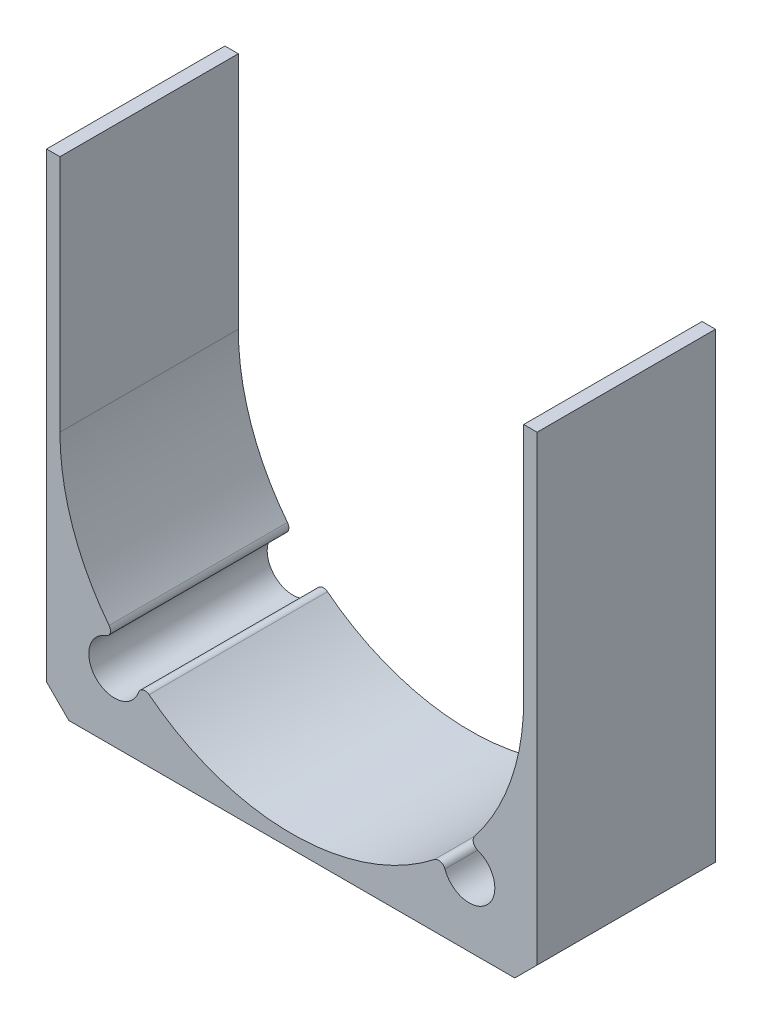
ISO-10303-21;
HEADER;
FILE_DESCRIPTION(('STEP AP214'),'2;1');
FILE_NAME('part.step','',(''),(''),'','','');
FILE_SCHEMA(('AUTOMOTIVE_DESIGN { 1 0 10303 214 1 1 1 1 }'));
ENDSEC;
DATA;
#1=APPLICATION_CONTEXT('core data for automotive mechanical design processes');
#2=APPLICATION_PROTOCOL_DEFINITION('international standard','automotive_design',2000,#1);
#3=PRODUCT_CONTEXT('',#1,'mechanical');
#4=PRODUCT('Part','Part','',(#3));
#5=PRODUCT_RELATED_PRODUCT_CATEGORY('part','',(#4));
#6=PRODUCT_DEFINITION_FORMATION('','',#4);
#7=PRODUCT_DEFINITION_CONTEXT('part definition',#1,'design');
#8=PRODUCT_DEFINITION('design','',#6,#7);
#9=PRODUCT_DEFINITION_SHAPE('','',#8);
#10=(LENGTH_UNIT() NAMED_UNIT(*) SI_UNIT(.MILLI.,.METRE.));
#11=(NAMED_UNIT(*) PLANE_ANGLE_UNIT() SI_UNIT($,.RADIAN.));
#12=(NAMED_UNIT(*) SI_UNIT($,.STERADIAN.) SOLID_ANGLE_UNIT());
#13=UNCERTAINTY_MEASURE_WITH_UNIT(LENGTH_MEASURE(1.E-05),#10,'distance_accuracy_value','');
#14=(GEOMETRIC_REPRESENTATION_CONTEXT(3) GLOBAL_UNCERTAINTY_ASSIGNED_CONTEXT((#13)) GLOBAL_UNIT_ASSIGNED_CONTEXT((#10,
#11,#12)) REPRESENTATION_CONTEXT('',''));
#15=CARTESIAN_POINT('',(0.,0.,0.));
#16=DIRECTION('',(0.,0.,1.));
#17=DIRECTION('',(1.,0.,0.));
#18=AXIS2_PLACEMENT_3D('',#15,#16,#17);
#19=CARTESIAN_POINT('',(0.,0.,80.));
#20=DIRECTION('',(0.,0.,-1.));
#21=DIRECTION('',(-1.,0.,0.));
#22=AXIS2_PLACEMENT_3D('',#19,#20,#21);
#23=CYLINDRICAL_SURFACE('',#22,104.);
#24=CARTESIAN_POINT('',(0.,0.,80.));
#25=DIRECTION('',(0.,0.,-1.));
#26=DIRECTION('',(1.,0.,0.));
#27=AXIS2_PLACEMENT_3D('',#24,#25,#26);
#28=CIRCLE('',#27,104.);
#29=CARTESIAN_POINT('',(-81.965079959966,-64.013480354972,80.));
#30=VERTEX_POINT('',#29);
#31=CARTESIAN_POINT('',(-104.,0.,80.));
#32=VERTEX_POINT('',#31);
#33=EDGE_CURVE('E333',#30,#32,#28,.T.);
#34=ORIENTED_EDGE('',*,*,#33,.F.);
#35=DIRECTION('',(0.,0.,-1.));
#36=VECTOR('',#35,1.);
#37=CARTESIAN_POINT('',(-81.965079959966,-64.013480354972,80.));
#38=LINE('',#37,#36);
#39=CARTESIAN_POINT('',(-81.965079959966,-64.013480354972,0.));
#40=VERTEX_POINT('',#39);
#41=EDGE_CURVE('E283',#30,#40,#38,.T.);
#42=ORIENTED_EDGE('',*,*,#41,.T.);
#43=CARTESIAN_POINT('',(0.,0.,0.));
#44=DIRECTION('',(0.,0.,-1.));
#45=DIRECTION('',(1.,0.,0.));
#46=AXIS2_PLACEMENT_3D('',#43,#44,#45);
#47=CIRCLE('',#46,104.);
#48=CARTESIAN_POINT('',(-104.,0.,0.));
#49=VERTEX_POINT('',#48);
#50=EDGE_CURVE('E210',#40,#49,#47,.T.);
#51=ORIENTED_EDGE('',*,*,#50,.T.);
#52=DIRECTION('',(0.,0.,-1.));
#53=VECTOR('',#52,1.);
#54=CARTESIAN_POINT('',(-104.,0.,80.));
#55=LINE('',#54,#53);
#56=EDGE_CURVE('E219',#32,#49,#55,.T.);
#57=ORIENTED_EDGE('',*,*,#56,.F.);
#58=EDGE_LOOP('',(#34,#42,#51,#57));
#59=FACE_BOUND('',#58,.T.);
#60=ADVANCED_FACE('F40',(#59),#23,.F.);
#61=CARTESIAN_POINT('',(64.013480354972,-81.965079959966,80.));
#62=VERTEX_POINT('',#61);
#63=CARTESIAN_POINT('',(-64.013480354972,-81.965079959966,80.));
#64=VERTEX_POINT('',#63);
#65=EDGE_CURVE('E337',#62,#64,#28,.T.);
#66=ORIENTED_EDGE('',*,*,#65,.F.);
#67=DIRECTION('',(0.,0.,-1.));
#68=VECTOR('',#67,1.);
#69=CARTESIAN_POINT('',(64.013480354972,-81.965079959966,80.));
#70=LINE('',#69,#68);
#71=CARTESIAN_POINT('',(64.013480354972,-81.965079959966,0.));
#72=VERTEX_POINT('',#71);
#73=EDGE_CURVE('E239',#62,#72,#70,.T.);
#74=ORIENTED_EDGE('',*,*,#73,.T.);
#75=CARTESIAN_POINT('',(-64.013480354972,-81.965079959966,0.));
#76=VERTEX_POINT('',#75);
#77=EDGE_CURVE('E216',#72,#76,#47,.T.);
#78=ORIENTED_EDGE('',*,*,#77,.T.);
#79=DIRECTION('',(0.,0.,-1.));
#80=VECTOR('',#79,1.);
#81=CARTESIAN_POINT('',(-64.013480354972,-81.965079959966,80.));
#82=LINE('',#81,#80);
#83=EDGE_CURVE('E235',#76,#64,#82,.F.);
#84=ORIENTED_EDGE('',*,*,#83,.T.);
#85=EDGE_LOOP('',(#66,#74,#78,#84));
#86=FACE_BOUND('',#85,.T.);
#87=ADVANCED_FACE('F404',(#86),#23,.F.);
#88=CARTESIAN_POINT('',(-110.,110.,80.));
#89=DIRECTION('',(1.,0.,0.));
#90=DIRECTION('',(0.,1.,0.));
#91=AXIS2_PLACEMENT_3D('',#88,#89,#90);
#92=PLANE('',#91);
#93=DIRECTION('',(0.,-1.,0.));
#94=VECTOR('',#93,1.);
#95=CARTESIAN_POINT('',(-110.,110.,80.));
#96=LINE('',#95,#94);
#97=CARTESIAN_POINT('',(-110.,107.,80.));
#98=VERTEX_POINT('',#97);
#99=CARTESIAN_POINT('',(-110.,-100.,80.));
#100=VERTEX_POINT('',#99);
#101=EDGE_CURVE('E181',#98,#100,#96,.T.);
#102=ORIENTED_EDGE('',*,*,#101,.F.);
#103=DIRECTION('',(0.,0.,1.));
#104=VECTOR('',#103,1.);
#105=CARTESIAN_POINT('',(-110.,107.,0.));
#106=LINE('',#105,#104);
#107=CARTESIAN_POINT('',(-110.,107.,0.));
#108=VERTEX_POINT('',#107);
#109=EDGE_CURVE('E166',#108,#98,#106,.T.);
#110=ORIENTED_EDGE('',*,*,#109,.F.);
#111=DIRECTION('',(0.,-1.,0.));
#112=VECTOR('',#111,1.);
#113=CARTESIAN_POINT('',(-110.,110.,0.));
#114=LINE('',#113,#112);
#115=CARTESIAN_POINT('',(-110.,-100.,0.));
#116=VERTEX_POINT('',#115);
#117=EDGE_CURVE('E179',#108,#116,#114,.T.);
#118=ORIENTED_EDGE('',*,*,#117,.T.);
#119=DIRECTION('',(0.,0.,1.));
#120=VECTOR('',#119,1.);
#121=CARTESIAN_POINT('',(-110.,-100.,80.));
#122=LINE('',#121,#120);
#123=EDGE_CURVE('E50',#116,#100,#122,.T.);
#124=ORIENTED_EDGE('',*,*,#123,.T.);
#125=EDGE_LOOP('',(#102,#110,#118,#124));
#126=FACE_BOUND('',#125,.T.);
#127=ADVANCED_FACE('F177',(#126),#92,.F.);
#128=CARTESIAN_POINT('',(110.,-110.,80.));
#129=DIRECTION('',(0.,1.,0.));
#130=DIRECTION('',(-1.,0.,0.));
#131=AXIS2_PLACEMENT_3D('',#128,#129,#130);
#132=PLANE('',#131);
#133=DIRECTION('',(1.,0.,0.));
#134=VECTOR('',#133,1.);
#135=CARTESIAN_POINT('',(110.,-110.,0.));
#136=LINE('',#135,#134);
#137=CARTESIAN_POINT('',(-100.,-110.,0.));
#138=VERTEX_POINT('',#137);
#139=CARTESIAN_POINT('',(100.,-110.,0.));
#140=VERTEX_POINT('',#139);
#141=EDGE_CURVE('E189',#138,#140,#136,.T.);
#142=ORIENTED_EDGE('',*,*,#141,.T.);
#143=DIRECTION('',(0.,0.,1.));
#144=VECTOR('',#143,1.);
#145=CARTESIAN_POINT('',(100.,-110.,80.));
#146=LINE('',#145,#144);
#147=CARTESIAN_POINT('',(100.,-110.,80.));
#148=VERTEX_POINT('',#147);
#149=EDGE_CURVE('E300',#140,#148,#146,.T.);
#150=ORIENTED_EDGE('',*,*,#149,.T.);
#151=DIRECTION('',(1.,0.,0.));
#152=VECTOR('',#151,1.);
#153=CARTESIAN_POINT('',(110.,-110.,80.));
#154=LINE('',#153,#152);
#155=CARTESIAN_POINT('',(-100.,-110.,80.));
#156=VERTEX_POINT('',#155);
#157=EDGE_CURVE('E316',#156,#148,#154,.T.);
#158=ORIENTED_EDGE('',*,*,#157,.F.);
#159=DIRECTION('',(0.,0.,-1.));
#160=VECTOR('',#159,1.);
#161=CARTESIAN_POINT('',(-100.,-110.,80.));
#162=LINE('',#161,#160);
#163=EDGE_CURVE('E296',#156,#138,#162,.T.);
#164=ORIENTED_EDGE('',*,*,#163,.T.);
#165=EDGE_LOOP('',(#142,#150,#158,#164));
#166=FACE_BOUND('',#165,.T.);
#167=ADVANCED_FACE('F319',(#166),#132,.F.);
#168=CARTESIAN_POINT('',(110.,110.,80.));
#169=DIRECTION('',(-1.,0.,0.));
#170=DIRECTION('',(0.,-1.,0.));
#171=AXIS2_PLACEMENT_3D('',#168,#169,#170);
#172=PLANE('',#171);
#173=DIRECTION('',(0.,1.,0.));
#174=VECTOR('',#173,1.);
#175=CARTESIAN_POINT('',(110.,110.,0.));
#176=LINE('',#175,#174);
#177=CARTESIAN_POINT('',(110.,-99.9999999999999,0.));
#178=VERTEX_POINT('',#177);
#179=CARTESIAN_POINT('',(110.,107.,0.));
#180=VERTEX_POINT('',#179);
#181=EDGE_CURVE('E195',#178,#180,#176,.T.);
#182=ORIENTED_EDGE('',*,*,#181,.T.);
#183=DIRECTION('',(0.,0.,1.));
#184=VECTOR('',#183,1.);
#185=CARTESIAN_POINT('',(110.,107.,0.));
#186=LINE('',#185,#184);
#187=CARTESIAN_POINT('',(110.,107.,80.));
#188=VERTEX_POINT('',#187);
#189=EDGE_CURVE('E65',#180,#188,#186,.T.);
#190=ORIENTED_EDGE('',*,*,#189,.T.);
#191=DIRECTION('',(0.,1.,0.));
#192=VECTOR('',#191,1.);
#193=CARTESIAN_POINT('',(110.,110.,80.));
#194=LINE('',#193,#192);
#195=CARTESIAN_POINT('',(110.,-99.9999999999999,80.));
#196=VERTEX_POINT('',#195);
#197=EDGE_CURVE('E322',#196,#188,#194,.T.);
#198=ORIENTED_EDGE('',*,*,#197,.F.);
#199=DIRECTION('',(0.,0.,-1.));
#200=VECTOR('',#199,1.);
#201=CARTESIAN_POINT('',(110.,-99.9999999999999,80.));
#202=LINE('',#201,#200);
#203=EDGE_CURVE('E287',#196,#178,#202,.T.);
#204=ORIENTED_EDGE('',*,*,#203,.T.);
#205=EDGE_LOOP('',(#182,#190,#198,#204));
#206=FACE_BOUND('',#205,.T.);
#207=ADVANCED_FACE('F385',(#206),#172,.F.);
#208=CARTESIAN_POINT('',(104.,0.,80.));
#209=DIRECTION('',(1.,0.,0.));
#210=DIRECTION('',(0.,0.,-1.));
#211=AXIS2_PLACEMENT_3D('',#208,#209,#210);
#212=PLANE('',#211);
#213=DIRECTION('',(0.,-1.,0.));
#214=VECTOR('',#213,1.);
#215=CARTESIAN_POINT('',(104.,0.,80.));
#216=LINE('',#215,#214);
#217=CARTESIAN_POINT('',(104.,107.,80.));
#218=VERTEX_POINT('',#217);
#219=CARTESIAN_POINT('',(104.,0.,80.));
#220=VERTEX_POINT('',#219);
#221=EDGE_CURVE('E327',#218,#220,#216,.T.);
#222=ORIENTED_EDGE('',*,*,#221,.F.);
#223=DIRECTION('',(0.,0.,-1.));
#224=VECTOR('',#223,1.);
#225=CARTESIAN_POINT('',(104.,107.,80.));
#226=LINE('',#225,#224);
#227=CARTESIAN_POINT('',(104.,107.,0.));
#228=VERTEX_POINT('',#227);
#229=EDGE_CURVE('E355',#218,#228,#226,.T.);
#230=ORIENTED_EDGE('',*,*,#229,.T.);
#231=DIRECTION('',(0.,-1.,0.));
#232=VECTOR('',#231,1.);
#233=CARTESIAN_POINT('',(104.,0.,0.));
#234=LINE('',#233,#232);
#235=CARTESIAN_POINT('',(104.,0.,0.));
#236=VERTEX_POINT('',#235);
#237=EDGE_CURVE('E207',#228,#236,#234,.T.);
#238=ORIENTED_EDGE('',*,*,#237,.T.);
#239=DIRECTION('',(0.,0.,-1.));
#240=VECTOR('',#239,1.);
#241=CARTESIAN_POINT('',(104.,0.,80.));
#242=LINE('',#241,#240);
#243=EDGE_CURVE('E223',#220,#236,#242,.T.);
#244=ORIENTED_EDGE('',*,*,#243,.F.);
#245=EDGE_LOOP('',(#222,#230,#238,#244));
#246=FACE_BOUND('',#245,.T.);
#247=ADVANCED_FACE('F382',(#246),#212,.F.);
#248=CARTESIAN_POINT('',(81.965079959966,-64.013480354972,0.));
#249=VERTEX_POINT('',#248);
#250=EDGE_CURVE('E211',#236,#249,#47,.T.);
#251=ORIENTED_EDGE('',*,*,#250,.T.);
#252=DIRECTION('',(0.,0.,-1.));
#253=VECTOR('',#252,1.);
#254=CARTESIAN_POINT('',(81.965079959966,-64.013480354972,80.));
#255=LINE('',#254,#253);
#256=CARTESIAN_POINT('',(81.965079959966,-64.013480354972,80.));
#257=VERTEX_POINT('',#256);
#258=EDGE_CURVE('E273',#249,#257,#255,.F.);
#259=ORIENTED_EDGE('',*,*,#258,.T.);
#260=EDGE_CURVE('E334',#220,#257,#28,.T.);
#261=ORIENTED_EDGE('',*,*,#260,.F.);
#262=ORIENTED_EDGE('',*,*,#243,.T.);
#263=EDGE_LOOP('',(#251,#259,#261,#262));
#264=FACE_BOUND('',#263,.T.);
#265=ADVANCED_FACE('F378',(#264),#23,.F.);
#266=CARTESIAN_POINT('',(-104.,0.,80.));
#267=DIRECTION('',(-1.,0.,0.));
#268=DIRECTION('',(0.,0.,1.));
#269=AXIS2_PLACEMENT_3D('',#266,#267,#268);
#270=PLANE('',#269);
#271=DIRECTION('',(0.,1.,0.));
#272=VECTOR('',#271,1.);
#273=CARTESIAN_POINT('',(-104.,0.,0.));
#274=LINE('',#273,#272);
#275=CARTESIAN_POINT('',(-104.,107.,0.));
#276=VERTEX_POINT('',#275);
#277=EDGE_CURVE('E215',#49,#276,#274,.T.);
#278=ORIENTED_EDGE('',*,*,#277,.T.);
#279=DIRECTION('',(0.,0.,1.));
#280=VECTOR('',#279,1.);
#281=CARTESIAN_POINT('',(-104.,107.,80.));
#282=LINE('',#281,#280);
#283=CARTESIAN_POINT('',(-104.,107.,80.));
#284=VERTEX_POINT('',#283);
#285=EDGE_CURVE('E57',#276,#284,#282,.T.);
#286=ORIENTED_EDGE('',*,*,#285,.T.);
#287=DIRECTION('',(0.,1.,0.));
#288=VECTOR('',#287,1.);
#289=CARTESIAN_POINT('',(-104.,0.,80.));
#290=LINE('',#289,#288);
#291=EDGE_CURVE('E201',#32,#284,#290,.T.);
#292=ORIENTED_EDGE('',*,*,#291,.F.);
#293=ORIENTED_EDGE('',*,*,#56,.T.);
#294=EDGE_LOOP('',(#278,#286,#292,#293));
#295=FACE_BOUND('',#294,.T.);
#296=ADVANCED_FACE('F353',(#295),#270,.F.);
#297=CARTESIAN_POINT('',(0.,0.,80.));
#298=DIRECTION('',(0.,0.,1.));
#299=DIRECTION('',(1.,0.,0.));
#300=AXIS2_PLACEMENT_3D('',#297,#298,#299);
#301=PLANE('',#300);
#302=DIRECTION('',(1.,0.,0.));
#303=VECTOR('',#302,1.);
#304=CARTESIAN_POINT('',(-110.,107.,80.));
#305=LINE('',#304,#303);
#306=EDGE_CURVE('E173',#98,#284,#305,.T.);
#307=ORIENTED_EDGE('',*,*,#306,.F.);
#308=ORIENTED_EDGE('',*,*,#101,.T.);
#309=DIRECTION('',(-0.707106781186547,0.707106781186548,0.));
#310=VECTOR('',#309,1.);
#311=CARTESIAN_POINT('',(-105.,-105.,80.));
#312=LINE('',#311,#310);
#313=EDGE_CURVE('E303',#100,#156,#312,.F.);
#314=ORIENTED_EDGE('',*,*,#313,.T.);
#315=ORIENTED_EDGE('',*,*,#157,.T.);
#316=DIRECTION('',(-0.707106781186549,-0.707106781186547,0.));
#317=VECTOR('',#316,1.);
#318=CARTESIAN_POINT('',(105.,-105.,80.));
#319=LINE('',#318,#317);
#320=EDGE_CURVE('E306',#148,#196,#319,.F.);
#321=ORIENTED_EDGE('',*,*,#320,.T.);
#322=ORIENTED_EDGE('',*,*,#197,.T.);
#323=EDGE_CURVE('E391',#218,#188,#305,.T.);
#324=ORIENTED_EDGE('',*,*,#323,.F.);
#325=ORIENTED_EDGE('',*,*,#221,.T.);
#326=ORIENTED_EDGE('',*,*,#260,.T.);
#327=CARTESIAN_POINT('',(84.3294572665035,-65.8600230575193,80.));
#328=DIRECTION('',(0.,0.,1.));
#329=DIRECTION('',(1.,0.,0.));
#330=AXIS2_PLACEMENT_3D('',#327,#328,#329);
#331=CIRCLE('',#330,3.);
#332=CARTESIAN_POINT('',(83.3405032562241,-68.6923312973745,80.));
#333=VERTEX_POINT('',#332);
#334=EDGE_CURVE('E267',#257,#333,#331,.T.);
#335=ORIENTED_EDGE('',*,*,#334,.T.);
#336=CARTESIAN_POINT('',(79.5495128834866,-79.5495128834866,80.));
#337=DIRECTION('',(0.,0.,1.));
#338=DIRECTION('',(1.,0.,0.));
#339=AXIS2_PLACEMENT_3D('',#336,#337,#338);
#340=CIRCLE('',#339,11.5);
#341=CARTESIAN_POINT('',(68.6923312973745,-83.3405032562241,80.));
#342=VERTEX_POINT('',#341);
#343=EDGE_CURVE('E198',#342,#333,#340,.T.);
#344=ORIENTED_EDGE('',*,*,#343,.F.);
#345=CARTESIAN_POINT('',(65.8600230575192,-84.3294572665035,80.));
#346=DIRECTION('',(0.,0.,1.));
#347=DIRECTION('',(1.,0.,0.));
#348=AXIS2_PLACEMENT_3D('',#345,#346,#347);
#349=CIRCLE('',#348,3.);
#350=EDGE_CURVE('E270',#342,#62,#349,.T.);
#351=ORIENTED_EDGE('',*,*,#350,.T.);
#352=ORIENTED_EDGE('',*,*,#65,.T.);
#353=CARTESIAN_POINT('',(-65.8600230575192,-84.3294572665035,80.));
#354=DIRECTION('',(0.,0.,1.));
#355=DIRECTION('',(1.,0.,0.));
#356=AXIS2_PLACEMENT_3D('',#353,#354,#355);
#357=CIRCLE('',#356,3.);
#358=CARTESIAN_POINT('',(-68.6923312973745,-83.3405032562241,80.));
#359=VERTEX_POINT('',#358);
#360=EDGE_CURVE('E264',#64,#359,#357,.T.);
#361=ORIENTED_EDGE('',*,*,#360,.T.);
#362=CARTESIAN_POINT('',(-79.5495128834866,-79.5495128834866,80.));
#363=DIRECTION('',(0.,0.,1.));
#364=DIRECTION('',(1.,0.,0.));
#365=AXIS2_PLACEMENT_3D('',#362,#363,#364);
#366=CIRCLE('',#365,11.5);
#367=CARTESIAN_POINT('',(-83.3405032562241,-68.6923312973745,80.));
#368=VERTEX_POINT('',#367);
#369=EDGE_CURVE('E190',#368,#359,#366,.T.);
#370=ORIENTED_EDGE('',*,*,#369,.F.);
#371=CARTESIAN_POINT('',(-84.3294572665035,-65.8600230575193,80.));
#372=DIRECTION('',(0.,0.,1.));
#373=DIRECTION('',(1.,0.,0.));
#374=AXIS2_PLACEMENT_3D('',#371,#372,#373);
#375=CIRCLE('',#374,3.);
#376=EDGE_CURVE('E261',#368,#30,#375,.T.);
#377=ORIENTED_EDGE('',*,*,#376,.T.);
#378=ORIENTED_EDGE('',*,*,#33,.T.);
#379=ORIENTED_EDGE('',*,*,#291,.T.);
#380=EDGE_LOOP('',(#307,#308,#314,#315,#321,#322,#324,#325,#326,#335,#344,#351,#352,#361,#370,
#377,#378,#379));
#381=FACE_BOUND('',#380,.T.);
#382=ADVANCED_FACE('F315',(#381),#301,.T.);
#383=CARTESIAN_POINT('',(0.,0.,0.));
#384=DIRECTION('',(0.,0.,1.));
#385=DIRECTION('',(1.,0.,0.));
#386=AXIS2_PLACEMENT_3D('',#383,#384,#385);
#387=PLANE('',#386);
#388=ORIENTED_EDGE('',*,*,#117,.F.);
#389=DIRECTION('',(1.,0.,0.));
#390=VECTOR('',#389,1.);
#391=CARTESIAN_POINT('',(-110.,107.,0.));
#392=LINE('',#391,#390);
#393=EDGE_CURVE('E163',#108,#276,#392,.T.);
#394=ORIENTED_EDGE('',*,*,#393,.T.);
#395=ORIENTED_EDGE('',*,*,#277,.F.);
#396=ORIENTED_EDGE('',*,*,#50,.F.);
#397=CARTESIAN_POINT('',(-84.3294572665035,-65.8600230575193,0.));
#398=DIRECTION('',(0.,0.,1.));
#399=DIRECTION('',(1.,0.,0.));
#400=AXIS2_PLACEMENT_3D('',#397,#398,#399);
#401=CIRCLE('',#400,3.);
#402=CARTESIAN_POINT('',(-83.3405032562241,-68.6923312973745,0.));
#403=VERTEX_POINT('',#402);
#404=EDGE_CURVE('E243',#40,#403,#401,.F.);
#405=ORIENTED_EDGE('',*,*,#404,.T.);
#406=CARTESIAN_POINT('',(-79.5495128834866,-79.5495128834866,0.));
#407=DIRECTION('',(0.,0.,1.));
#408=DIRECTION('',(1.,0.,0.));
#409=AXIS2_PLACEMENT_3D('',#406,#407,#408);
#410=CIRCLE('',#409,11.5);
#411=CARTESIAN_POINT('',(-68.6923312973745,-83.3405032562241,0.));
#412=VERTEX_POINT('',#411);
#413=EDGE_CURVE('E231',#403,#412,#410,.T.);
#414=ORIENTED_EDGE('',*,*,#413,.T.);
#415=CARTESIAN_POINT('',(-65.8600230575192,-84.3294572665035,0.));
#416=DIRECTION('',(0.,0.,1.));
#417=DIRECTION('',(1.,0.,0.));
#418=AXIS2_PLACEMENT_3D('',#415,#416,#417);
#419=CIRCLE('',#418,3.);
#420=EDGE_CURVE('E246',#412,#76,#419,.F.);
#421=ORIENTED_EDGE('',*,*,#420,.T.);
#422=ORIENTED_EDGE('',*,*,#77,.F.);
#423=CARTESIAN_POINT('',(65.8600230575192,-84.3294572665035,0.));
#424=DIRECTION('',(0.,0.,1.));
#425=DIRECTION('',(1.,0.,0.));
#426=AXIS2_PLACEMENT_3D('',#423,#424,#425);
#427=CIRCLE('',#426,3.);
#428=CARTESIAN_POINT('',(68.6923312973745,-83.3405032562241,0.));
#429=VERTEX_POINT('',#428);
#430=EDGE_CURVE('E252',#72,#429,#427,.F.);
#431=ORIENTED_EDGE('',*,*,#430,.T.);
#432=CARTESIAN_POINT('',(79.5495128834866,-79.5495128834866,0.));
#433=DIRECTION('',(0.,0.,1.));
#434=DIRECTION('',(1.,0.,0.));
#435=AXIS2_PLACEMENT_3D('',#432,#433,#434);
#436=CIRCLE('',#435,11.5);
#437=CARTESIAN_POINT('',(83.3405032562241,-68.6923312973745,0.));
#438=VERTEX_POINT('',#437);
#439=EDGE_CURVE('E227',#429,#438,#436,.T.);
#440=ORIENTED_EDGE('',*,*,#439,.T.);
#441=CARTESIAN_POINT('',(84.3294572665035,-65.8600230575193,0.));
#442=DIRECTION('',(0.,0.,1.));
#443=DIRECTION('',(1.,0.,0.));
#444=AXIS2_PLACEMENT_3D('',#441,#442,#443);
#445=CIRCLE('',#444,3.);
#446=EDGE_CURVE('E249',#438,#249,#445,.F.);
#447=ORIENTED_EDGE('',*,*,#446,.T.);
#448=ORIENTED_EDGE('',*,*,#250,.F.);
#449=ORIENTED_EDGE('',*,*,#237,.F.);
#450=DIRECTION('',(1.,0.,0.));
#451=VECTOR('',#450,1.);
#452=CARTESIAN_POINT('',(0.,107.,0.));
#453=LINE('',#452,#451);
#454=EDGE_CURVE('E11',#228,#180,#453,.T.);
#455=ORIENTED_EDGE('',*,*,#454,.T.);
#456=ORIENTED_EDGE('',*,*,#181,.F.);
#457=DIRECTION('',(0.707106781186549,0.707106781186547,0.));
#458=VECTOR('',#457,1.);
#459=CARTESIAN_POINT('',(110.,-99.9999999999999,0.));
#460=LINE('',#459,#458);
#461=EDGE_CURVE('E293',#178,#140,#460,.F.);
#462=ORIENTED_EDGE('',*,*,#461,.T.);
#463=ORIENTED_EDGE('',*,*,#141,.F.);
#464=DIRECTION('',(0.707106781186547,-0.707106781186548,0.));
#465=VECTOR('',#464,1.);
#466=CARTESIAN_POINT('',(-100.,-110.,0.));
#467=LINE('',#466,#465);
#468=EDGE_CURVE('E186',#138,#116,#467,.F.);
#469=ORIENTED_EDGE('',*,*,#468,.T.);
#470=EDGE_LOOP('',(#388,#394,#395,#396,#405,#414,#421,#422,#431,#440,#447,#448,#449,#455,#456,
#462,#463,#469));
#471=FACE_BOUND('',#470,.T.);
#472=ADVANCED_FACE('F184',(#471),#387,.F.);
#473=CARTESIAN_POINT('',(79.5495128834866,-79.5495128834866,0.));
#474=DIRECTION('',(0.,0.,1.));
#475=DIRECTION('',(1.,0.,0.));
#476=AXIS2_PLACEMENT_3D('',#473,#474,#475);
#477=CYLINDRICAL_SURFACE('',#476,11.5);
#478=ORIENTED_EDGE('',*,*,#439,.F.);
#479=DIRECTION('',(0.,0.,1.));
#480=VECTOR('',#479,1.);
#481=CARTESIAN_POINT('',(68.6923312973745,-83.3405032562241,0.));
#482=LINE('',#481,#480);
#483=EDGE_CURVE('E258',#429,#342,#482,.T.);
#484=ORIENTED_EDGE('',*,*,#483,.T.);
#485=ORIENTED_EDGE('',*,*,#343,.T.);
#486=DIRECTION('',(0.,0.,1.));
#487=VECTOR('',#486,1.);
#488=CARTESIAN_POINT('',(83.3405032562241,-68.6923312973745,0.));
#489=LINE('',#488,#487);
#490=EDGE_CURVE('E255',#333,#438,#489,.F.);
#491=ORIENTED_EDGE('',*,*,#490,.T.);
#492=EDGE_LOOP('',(#478,#484,#485,#491));
#493=FACE_BOUND('',#492,.T.);
#494=ADVANCED_FACE('F368',(#493),#477,.F.);
#495=CARTESIAN_POINT('',(-79.5495128834866,-79.5495128834866,0.));
#496=DIRECTION('',(0.,0.,1.));
#497=DIRECTION('',(1.,0.,0.));
#498=AXIS2_PLACEMENT_3D('',#495,#496,#497);
#499=CYLINDRICAL_SURFACE('',#498,11.5);
#500=ORIENTED_EDGE('',*,*,#369,.T.);
#501=DIRECTION('',(0.,0.,1.));
#502=VECTOR('',#501,1.);
#503=CARTESIAN_POINT('',(-68.6923312973745,-83.3405032562241,0.));
#504=LINE('',#503,#502);
#505=EDGE_CURVE('E280',#359,#412,#504,.F.);
#506=ORIENTED_EDGE('',*,*,#505,.T.);
#507=ORIENTED_EDGE('',*,*,#413,.F.);
#508=DIRECTION('',(0.,0.,1.));
#509=VECTOR('',#508,1.);
#510=CARTESIAN_POINT('',(-83.3405032562241,-68.6923312973745,0.));
#511=LINE('',#510,#509);
#512=EDGE_CURVE('E277',#403,#368,#511,.T.);
#513=ORIENTED_EDGE('',*,*,#512,.T.);
#514=EDGE_LOOP('',(#500,#506,#507,#513));
#515=FACE_BOUND('',#514,.T.);
#516=ADVANCED_FACE('F430',(#515),#499,.F.);
#517=CARTESIAN_POINT('',(65.8600230575192,-84.3294572665035,0.));
#518=DIRECTION('',(0.,0.,-1.));
#519=DIRECTION('',(-1.,0.,0.));
#520=AXIS2_PLACEMENT_3D('',#517,#518,#519);
#521=CYLINDRICAL_SURFACE('',#520,3.);
#522=ORIENTED_EDGE('',*,*,#350,.F.);
#523=ORIENTED_EDGE('',*,*,#483,.F.);
#524=ORIENTED_EDGE('',*,*,#430,.F.);
#525=ORIENTED_EDGE('',*,*,#73,.F.);
#526=EDGE_LOOP('',(#522,#523,#524,#525));
#527=FACE_BOUND('',#526,.T.);
#528=ADVANCED_FACE('F427',(#527),#521,.T.);
#529=CARTESIAN_POINT('',(84.3294572665035,-65.8600230575193,0.));
#530=DIRECTION('',(0.,0.,1.));
#531=DIRECTION('',(1.,0.,0.));
#532=AXIS2_PLACEMENT_3D('',#529,#530,#531);
#533=CYLINDRICAL_SURFACE('',#532,3.);
#534=ORIENTED_EDGE('',*,*,#446,.F.);
#535=ORIENTED_EDGE('',*,*,#490,.F.);
#536=ORIENTED_EDGE('',*,*,#334,.F.);
#537=ORIENTED_EDGE('',*,*,#258,.F.);
#538=EDGE_LOOP('',(#534,#535,#536,#537));
#539=FACE_BOUND('',#538,.T.);
#540=ADVANCED_FACE('F373',(#539),#533,.T.);
#541=CARTESIAN_POINT('',(-65.8600230575192,-84.3294572665035,0.));
#542=DIRECTION('',(0.,0.,1.));
#543=DIRECTION('',(1.,0.,0.));
#544=AXIS2_PLACEMENT_3D('',#541,#542,#543);
#545=CYLINDRICAL_SURFACE('',#544,3.);
#546=ORIENTED_EDGE('',*,*,#420,.F.);
#547=ORIENTED_EDGE('',*,*,#505,.F.);
#548=ORIENTED_EDGE('',*,*,#360,.F.);
#549=ORIENTED_EDGE('',*,*,#83,.F.);
#550=EDGE_LOOP('',(#546,#547,#548,#549));
#551=FACE_BOUND('',#550,.T.);
#552=ADVANCED_FACE('F434',(#551),#545,.T.);
#553=CARTESIAN_POINT('',(-84.3294572665035,-65.8600230575193,0.));
#554=DIRECTION('',(0.,0.,-1.));
#555=DIRECTION('',(-1.,0.,0.));
#556=AXIS2_PLACEMENT_3D('',#553,#554,#555);
#557=CYLINDRICAL_SURFACE('',#556,3.);
#558=ORIENTED_EDGE('',*,*,#376,.F.);
#559=ORIENTED_EDGE('',*,*,#512,.F.);
#560=ORIENTED_EDGE('',*,*,#404,.F.);
#561=ORIENTED_EDGE('',*,*,#41,.F.);
#562=EDGE_LOOP('',(#558,#559,#560,#561));
#563=FACE_BOUND('',#562,.T.);
#564=ADVANCED_FACE('F437',(#563),#557,.T.);
#565=CARTESIAN_POINT('',(110.,-99.9999999999999,80.));
#566=DIRECTION('',(-0.707106781186546,0.707106781186548,0.));
#567=DIRECTION('',(0.,0.,-1.));
#568=AXIS2_PLACEMENT_3D('',#565,#566,#567);
#569=PLANE('',#568);
#570=ORIENTED_EDGE('',*,*,#320,.F.);
#571=ORIENTED_EDGE('',*,*,#149,.F.);
#572=ORIENTED_EDGE('',*,*,#461,.F.);
#573=ORIENTED_EDGE('',*,*,#203,.F.);
#574=EDGE_LOOP('',(#570,#571,#572,#573));
#575=FACE_BOUND('',#574,.T.);
#576=ADVANCED_FACE('F389',(#575),#569,.F.);
#577=CARTESIAN_POINT('',(-100.,-110.,80.));
#578=DIRECTION('',(0.707106781186548,0.707106781186547,0.));
#579=DIRECTION('',(0.,0.,-1.));
#580=AXIS2_PLACEMENT_3D('',#577,#578,#579);
#581=PLANE('',#580);
#582=ORIENTED_EDGE('',*,*,#313,.F.);
#583=ORIENTED_EDGE('',*,*,#123,.F.);
#584=ORIENTED_EDGE('',*,*,#468,.F.);
#585=ORIENTED_EDGE('',*,*,#163,.F.);
#586=EDGE_LOOP('',(#582,#583,#584,#585));
#587=FACE_BOUND('',#586,.T.);
#588=ADVANCED_FACE('F43',(#587),#581,.F.);
#589=CARTESIAN_POINT('',(-110.,107.,0.));
#590=DIRECTION('',(0.,-1.,0.));
#591=DIRECTION('',(0.,0.,-1.));
#592=AXIS2_PLACEMENT_3D('',#589,#590,#591);
#593=PLANE('',#592);
#594=ORIENTED_EDGE('',*,*,#323,.T.);
#595=ORIENTED_EDGE('',*,*,#189,.F.);
#596=ORIENTED_EDGE('',*,*,#454,.F.);
#597=ORIENTED_EDGE('',*,*,#229,.F.);
#598=EDGE_LOOP('',(#594,#595,#596,#597));
#599=FACE_BOUND('',#598,.T.);
#600=ADVANCED_FACE('F395',(#599),#593,.F.);
#601=ORIENTED_EDGE('',*,*,#393,.F.);
#602=ORIENTED_EDGE('',*,*,#109,.T.);
#603=ORIENTED_EDGE('',*,*,#306,.T.);
#604=ORIENTED_EDGE('',*,*,#285,.F.);
#605=EDGE_LOOP('',(#601,#602,#603,#604));
#606=FACE_BOUND('',#605,.T.);
#607=ADVANCED_FACE('F165',(#606),#593,.F.);
#608=CLOSED_SHELL('',(#60,#87,#127,#167,#207,#247,#265,#296,#382,#472,#494,#516,#528,#540,#552,
#564,#576,#588,#600,#607));
#609=MANIFOLD_SOLID_BREP('B2',#608);
#610=ADVANCED_BREP_SHAPE_REPRESENTATION('',(#18,#609),#14);
#611=SHAPE_DEFINITION_REPRESENTATION(#9,#610);
ENDSEC;
END-ISO-10303-21;
